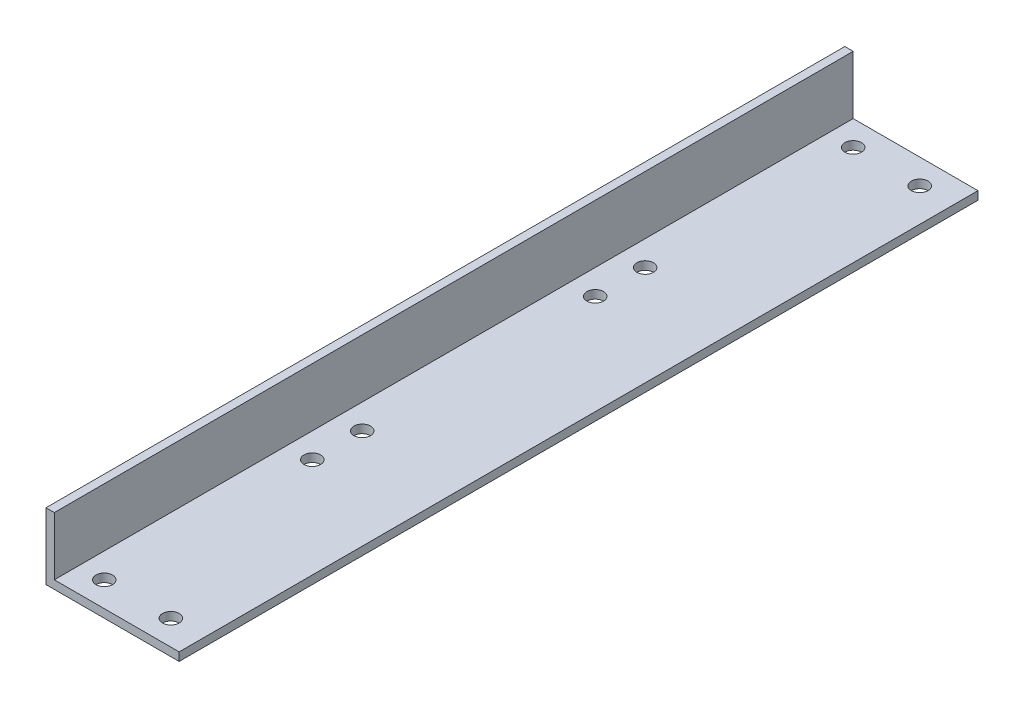
ISO-10303-21;
HEADER;
FILE_DESCRIPTION(('STEP AP214'),'2;1');
FILE_NAME('part.step','',(''),(''),'','','');
FILE_SCHEMA(('AUTOMOTIVE_DESIGN { 1 0 10303 214 1 1 1 1 }'));
ENDSEC;
DATA;
#1=APPLICATION_CONTEXT('core data for automotive mechanical design processes');
#2=APPLICATION_PROTOCOL_DEFINITION('international standard','automotive_design',2000,#1);
#3=PRODUCT_CONTEXT('',#1,'mechanical');
#4=PRODUCT('Part','Part','',(#3));
#5=PRODUCT_RELATED_PRODUCT_CATEGORY('part','',(#4));
#6=PRODUCT_DEFINITION_FORMATION('','',#4);
#7=PRODUCT_DEFINITION_CONTEXT('part definition',#1,'design');
#8=PRODUCT_DEFINITION('design','',#6,#7);
#9=PRODUCT_DEFINITION_SHAPE('','',#8);
#10=(LENGTH_UNIT() NAMED_UNIT(*) SI_UNIT(.MILLI.,.METRE.));
#11=(NAMED_UNIT(*) PLANE_ANGLE_UNIT() SI_UNIT($,.RADIAN.));
#12=(NAMED_UNIT(*) SI_UNIT($,.STERADIAN.) SOLID_ANGLE_UNIT());
#13=UNCERTAINTY_MEASURE_WITH_UNIT(LENGTH_MEASURE(1.E-05),#10,'distance_accuracy_value','');
#14=(GEOMETRIC_REPRESENTATION_CONTEXT(3) GLOBAL_UNCERTAINTY_ASSIGNED_CONTEXT((#13)) GLOBAL_UNIT_ASSIGNED_CONTEXT((#10,
#11,#12)) REPRESENTATION_CONTEXT('',''));
#15=CARTESIAN_POINT('',(0.,0.,0.));
#16=DIRECTION('',(0.,0.,1.));
#17=DIRECTION('',(1.,0.,0.));
#18=AXIS2_PLACEMENT_3D('',#15,#16,#17);
#19=CARTESIAN_POINT('',(3.175,3.17499999999999,304.8));
#20=DIRECTION('',(-1.,0.,0.));
#21=DIRECTION('',(0.,-1.,0.));
#22=AXIS2_PLACEMENT_3D('',#19,#20,#21);
#23=PLANE('',#22);
#24=DIRECTION('',(0.,0.,-1.));
#25=VECTOR('',#24,1.);
#26=CARTESIAN_POINT('',(3.175,25.4,304.8));
#27=LINE('',#26,#25);
#28=CARTESIAN_POINT('',(3.175,25.4,0.));
#29=VERTEX_POINT('',#28);
#30=CARTESIAN_POINT('',(3.175,25.4,304.8));
#31=VERTEX_POINT('',#30);
#32=EDGE_CURVE('E104',#29,#31,#27,.F.);
#33=ORIENTED_EDGE('',*,*,#32,.T.);
#34=DIRECTION('',(0.,1.,0.));
#35=VECTOR('',#34,1.);
#36=CARTESIAN_POINT('',(3.175,0.,304.8));
#37=LINE('',#36,#35);
#38=CARTESIAN_POINT('',(3.175,3.175,304.8));
#39=VERTEX_POINT('',#38);
#40=EDGE_CURVE('E91',#39,#31,#37,.T.);
#41=ORIENTED_EDGE('',*,*,#40,.F.);
#42=DIRECTION('',(0.,0.,1.));
#43=VECTOR('',#42,1.);
#44=CARTESIAN_POINT('',(3.175,3.17499999999999,304.8));
#45=LINE('',#44,#43);
#46=CARTESIAN_POINT('',(3.175,3.175,0.));
#47=VERTEX_POINT('',#46);
#48=EDGE_CURVE('E67',#39,#47,#45,.F.);
#49=ORIENTED_EDGE('',*,*,#48,.T.);
#50=DIRECTION('',(0.,1.,0.));
#51=VECTOR('',#50,1.);
#52=CARTESIAN_POINT('',(3.175,0.,0.));
#53=LINE('',#52,#51);
#54=EDGE_CURVE('E219',#47,#29,#53,.T.);
#55=ORIENTED_EDGE('',*,*,#54,.T.);
#56=EDGE_LOOP('',(#33,#41,#49,#55));
#57=FACE_BOUND('',#56,.T.);
#58=ADVANCED_FACE('F17',(#57),#23,.F.);
#59=CARTESIAN_POINT('',(3.175,25.4,304.8));
#60=DIRECTION('',(0.,-1.,0.));
#61=DIRECTION('',(0.,0.,-1.));
#62=AXIS2_PLACEMENT_3D('',#59,#60,#61);
#63=PLANE('',#62);
#64=DIRECTION('',(0.,0.,1.));
#65=VECTOR('',#64,1.);
#66=CARTESIAN_POINT('',(0.,25.4,304.8));
#67=LINE('',#66,#65);
#68=CARTESIAN_POINT('',(0.,25.4,0.));
#69=VERTEX_POINT('',#68);
#70=CARTESIAN_POINT('',(0.,25.4,304.8));
#71=VERTEX_POINT('',#70);
#72=EDGE_CURVE('E73',#69,#71,#67,.T.);
#73=ORIENTED_EDGE('',*,*,#72,.T.);
#74=DIRECTION('',(1.,0.,0.));
#75=VECTOR('',#74,1.);
#76=CARTESIAN_POINT('',(0.,25.4,304.8));
#77=LINE('',#76,#75);
#78=EDGE_CURVE('E76',#31,#71,#77,.F.);
#79=ORIENTED_EDGE('',*,*,#78,.F.);
#80=ORIENTED_EDGE('',*,*,#32,.F.);
#81=DIRECTION('',(1.,0.,0.));
#82=VECTOR('',#81,1.);
#83=CARTESIAN_POINT('',(0.,25.4,0.));
#84=LINE('',#83,#82);
#85=EDGE_CURVE('E78',#29,#69,#84,.F.);
#86=ORIENTED_EDGE('',*,*,#85,.T.);
#87=EDGE_LOOP('',(#73,#79,#80,#86));
#88=FACE_BOUND('',#87,.T.);
#89=ADVANCED_FACE('F75',(#88),#63,.F.);
#90=CARTESIAN_POINT('',(50.8,3.175,304.8));
#91=DIRECTION('',(0.,-1.,0.));
#92=DIRECTION('',(1.,0.,0.));
#93=AXIS2_PLACEMENT_3D('',#90,#91,#92);
#94=PLANE('',#93);
#95=CARTESIAN_POINT('',(38.1,3.175,295.275));
#96=DIRECTION('',(0.,-1.,0.));
#97=DIRECTION('',(0.,0.,-1.));
#98=AXIS2_PLACEMENT_3D('',#95,#96,#97);
#99=CIRCLE('',#98,3.17499999999998);
#100=CARTESIAN_POINT('',(38.1,3.175,292.1));
#101=VERTEX_POINT('',#100);
#102=EDGE_CURVE('E127',#101,#101,#99,.T.);
#103=ORIENTED_EDGE('',*,*,#102,.T.);
#104=EDGE_LOOP('',(#103));
#105=FACE_BOUND('',#104,.T.);
#106=CARTESIAN_POINT('',(12.7,3.175,295.275));
#107=DIRECTION('',(0.,-1.,0.));
#108=DIRECTION('',(0.,0.,-1.));
#109=AXIS2_PLACEMENT_3D('',#106,#107,#108);
#110=CIRCLE('',#109,3.17499999999998);
#111=CARTESIAN_POINT('',(12.7,3.175,292.1));
#112=VERTEX_POINT('',#111);
#113=EDGE_CURVE('E130',#112,#112,#110,.T.);
#114=ORIENTED_EDGE('',*,*,#113,.T.);
#115=EDGE_LOOP('',(#114));
#116=FACE_BOUND('',#115,.T.);
#117=CARTESIAN_POINT('',(12.7,3.175,196.85));
#118=DIRECTION('',(0.,-1.,0.));
#119=DIRECTION('',(0.,0.,-1.));
#120=AXIS2_PLACEMENT_3D('',#117,#118,#119);
#121=CIRCLE('',#120,3.17500000000001);
#122=CARTESIAN_POINT('',(12.7,3.175,193.675));
#123=VERTEX_POINT('',#122);
#124=EDGE_CURVE('E133',#123,#123,#121,.T.);
#125=ORIENTED_EDGE('',*,*,#124,.T.);
#126=EDGE_LOOP('',(#125));
#127=FACE_BOUND('',#126,.T.);
#128=CARTESIAN_POINT('',(12.7,3.175,215.9));
#129=DIRECTION('',(0.,-1.,0.));
#130=DIRECTION('',(0.,0.,-1.));
#131=AXIS2_PLACEMENT_3D('',#128,#129,#130);
#132=CIRCLE('',#131,3.17500000000001);
#133=CARTESIAN_POINT('',(12.7,3.175,212.725));
#134=VERTEX_POINT('',#133);
#135=EDGE_CURVE('E136',#134,#134,#132,.T.);
#136=ORIENTED_EDGE('',*,*,#135,.T.);
#137=EDGE_LOOP('',(#136));
#138=FACE_BOUND('',#137,.T.);
#139=ORIENTED_EDGE('',*,*,#48,.F.);
#140=DIRECTION('',(1.,0.,0.));
#141=VECTOR('',#140,1.);
#142=CARTESIAN_POINT('',(0.,3.175,304.8));
#143=LINE('',#142,#141);
#144=CARTESIAN_POINT('',(50.8,3.175,304.8));
#145=VERTEX_POINT('',#144);
#146=EDGE_CURVE('E98',#145,#39,#143,.F.);
#147=ORIENTED_EDGE('',*,*,#146,.F.);
#148=DIRECTION('',(0.,0.,1.));
#149=VECTOR('',#148,1.);
#150=CARTESIAN_POINT('',(50.8,3.175,304.8));
#151=LINE('',#150,#149);
#152=CARTESIAN_POINT('',(50.8,3.175,0.));
#153=VERTEX_POINT('',#152);
#154=EDGE_CURVE('E228',#145,#153,#151,.F.);
#155=ORIENTED_EDGE('',*,*,#154,.T.);
#156=DIRECTION('',(1.,0.,0.));
#157=VECTOR('',#156,1.);
#158=CARTESIAN_POINT('',(0.,3.175,0.));
#159=LINE('',#158,#157);
#160=EDGE_CURVE('E222',#153,#47,#159,.F.);
#161=ORIENTED_EDGE('',*,*,#160,.T.);
#162=EDGE_LOOP('',(#139,#147,#155,#161));
#163=FACE_BOUND('',#162,.T.);
#164=CARTESIAN_POINT('',(12.7,3.175,9.525));
#165=DIRECTION('',(0.,-1.,0.));
#166=DIRECTION('',(0.,0.,-1.));
#167=AXIS2_PLACEMENT_3D('',#164,#165,#166);
#168=CIRCLE('',#167,3.175);
#169=CARTESIAN_POINT('',(12.7,3.175,6.35));
#170=VERTEX_POINT('',#169);
#171=EDGE_CURVE('E84',#170,#170,#168,.T.);
#172=ORIENTED_EDGE('',*,*,#171,.T.);
#173=EDGE_LOOP('',(#172));
#174=FACE_BOUND('',#173,.T.);
#175=CARTESIAN_POINT('',(38.1,3.175,9.525));
#176=DIRECTION('',(0.,-1.,0.));
#177=DIRECTION('',(0.,0.,-1.));
#178=AXIS2_PLACEMENT_3D('',#175,#176,#177);
#179=CIRCLE('',#178,3.175);
#180=CARTESIAN_POINT('',(38.1,3.175,6.35000000000001));
#181=VERTEX_POINT('',#180);
#182=EDGE_CURVE('E142',#181,#181,#179,.T.);
#183=ORIENTED_EDGE('',*,*,#182,.T.);
#184=EDGE_LOOP('',(#183));
#185=FACE_BOUND('',#184,.T.);
#186=CARTESIAN_POINT('',(12.7,3.175,107.95));
#187=DIRECTION('',(0.,-1.,0.));
#188=DIRECTION('',(0.,0.,-1.));
#189=AXIS2_PLACEMENT_3D('',#186,#187,#188);
#190=CIRCLE('',#189,3.175);
#191=CARTESIAN_POINT('',(12.7,3.175,104.775));
#192=VERTEX_POINT('',#191);
#193=EDGE_CURVE('E144',#192,#192,#190,.T.);
#194=ORIENTED_EDGE('',*,*,#193,.T.);
#195=EDGE_LOOP('',(#194));
#196=FACE_BOUND('',#195,.T.);
#197=CARTESIAN_POINT('',(12.7,3.175,88.9));
#198=DIRECTION('',(0.,-1.,0.));
#199=DIRECTION('',(0.,0.,-1.));
#200=AXIS2_PLACEMENT_3D('',#197,#198,#199);
#201=CIRCLE('',#200,3.175);
#202=CARTESIAN_POINT('',(12.7,3.175,85.725));
#203=VERTEX_POINT('',#202);
#204=EDGE_CURVE('E20',#203,#203,#201,.T.);
#205=ORIENTED_EDGE('',*,*,#204,.T.);
#206=EDGE_LOOP('',(#205));
#207=FACE_BOUND('',#206,.T.);
#208=ADVANCED_FACE('F151',(#105,#116,#127,#138,#163,#174,#185,#196,#207),#94,.F.);
#209=CARTESIAN_POINT('',(12.7,25.4,88.9));
#210=DIRECTION('',(0.,-1.,0.));
#211=DIRECTION('',(0.,0.,-1.));
#212=AXIS2_PLACEMENT_3D('',#209,#210,#211);
#213=CYLINDRICAL_SURFACE('',#212,3.175);
#214=ORIENTED_EDGE('',*,*,#204,.F.);
#215=EDGE_LOOP('',(#214));
#216=FACE_BOUND('',#215,.T.);
#217=CARTESIAN_POINT('',(12.7,0.,88.9));
#218=DIRECTION('',(0.,-1.,0.));
#219=DIRECTION('',(0.,0.,-1.));
#220=AXIS2_PLACEMENT_3D('',#217,#218,#219);
#221=CIRCLE('',#220,3.175);
#222=CARTESIAN_POINT('',(12.7,0.,85.725));
#223=VERTEX_POINT('',#222);
#224=EDGE_CURVE('E124',#223,#223,#221,.T.);
#225=ORIENTED_EDGE('',*,*,#224,.T.);
#226=EDGE_LOOP('',(#225));
#227=FACE_BOUND('',#226,.T.);
#228=ADVANCED_FACE('F153',(#216,#227),#213,.F.);
#229=CARTESIAN_POINT('',(12.7,25.4,107.95));
#230=DIRECTION('',(0.,-1.,0.));
#231=DIRECTION('',(0.,0.,-1.));
#232=AXIS2_PLACEMENT_3D('',#229,#230,#231);
#233=CYLINDRICAL_SURFACE('',#232,3.175);
#234=ORIENTED_EDGE('',*,*,#193,.F.);
#235=EDGE_LOOP('',(#234));
#236=FACE_BOUND('',#235,.T.);
#237=CARTESIAN_POINT('',(12.7,0.,107.95));
#238=DIRECTION('',(0.,-1.,0.));
#239=DIRECTION('',(0.,0.,-1.));
#240=AXIS2_PLACEMENT_3D('',#237,#238,#239);
#241=CIRCLE('',#240,3.175);
#242=CARTESIAN_POINT('',(12.7,0.,104.775));
#243=VERTEX_POINT('',#242);
#244=EDGE_CURVE('E121',#243,#243,#241,.T.);
#245=ORIENTED_EDGE('',*,*,#244,.T.);
#246=EDGE_LOOP('',(#245));
#247=FACE_BOUND('',#246,.T.);
#248=ADVANCED_FACE('F156',(#236,#247),#233,.F.);
#249=CARTESIAN_POINT('',(38.1,25.4,9.525));
#250=DIRECTION('',(0.,-1.,0.));
#251=DIRECTION('',(0.,0.,-1.));
#252=AXIS2_PLACEMENT_3D('',#249,#250,#251);
#253=CYLINDRICAL_SURFACE('',#252,3.175);
#254=ORIENTED_EDGE('',*,*,#182,.F.);
#255=EDGE_LOOP('',(#254));
#256=FACE_BOUND('',#255,.T.);
#257=CARTESIAN_POINT('',(38.1,0.,9.525));
#258=DIRECTION('',(0.,-1.,0.));
#259=DIRECTION('',(0.,0.,-1.));
#260=AXIS2_PLACEMENT_3D('',#257,#258,#259);
#261=CIRCLE('',#260,3.175);
#262=CARTESIAN_POINT('',(38.1,0.,6.35000000000001));
#263=VERTEX_POINT('',#262);
#264=EDGE_CURVE('E118',#263,#263,#261,.T.);
#265=ORIENTED_EDGE('',*,*,#264,.T.);
#266=EDGE_LOOP('',(#265));
#267=FACE_BOUND('',#266,.T.);
#268=ADVANCED_FACE('F200',(#256,#267),#253,.F.);
#269=CARTESIAN_POINT('',(12.7,25.4,9.525));
#270=DIRECTION('',(0.,-1.,0.));
#271=DIRECTION('',(0.,0.,-1.));
#272=AXIS2_PLACEMENT_3D('',#269,#270,#271);
#273=CYLINDRICAL_SURFACE('',#272,3.175);
#274=ORIENTED_EDGE('',*,*,#171,.F.);
#275=EDGE_LOOP('',(#274));
#276=FACE_BOUND('',#275,.T.);
#277=CARTESIAN_POINT('',(12.7,0.,9.525));
#278=DIRECTION('',(0.,-1.,0.));
#279=DIRECTION('',(0.,0.,-1.));
#280=AXIS2_PLACEMENT_3D('',#277,#278,#279);
#281=CIRCLE('',#280,3.175);
#282=CARTESIAN_POINT('',(12.7,0.,6.35));
#283=VERTEX_POINT('',#282);
#284=EDGE_CURVE('E115',#283,#283,#281,.T.);
#285=ORIENTED_EDGE('',*,*,#284,.T.);
#286=EDGE_LOOP('',(#285));
#287=FACE_BOUND('',#286,.T.);
#288=ADVANCED_FACE('F197',(#276,#287),#273,.F.);
#289=CARTESIAN_POINT('',(0.,25.4,304.8));
#290=DIRECTION('',(1.,0.,0.));
#291=DIRECTION('',(0.,1.,0.));
#292=AXIS2_PLACEMENT_3D('',#289,#290,#291);
#293=PLANE('',#292);
#294=DIRECTION('',(0.,0.,1.));
#295=VECTOR('',#294,1.);
#296=CARTESIAN_POINT('',(0.,0.,304.8));
#297=LINE('',#296,#295);
#298=CARTESIAN_POINT('',(0.,0.,0.));
#299=VERTEX_POINT('',#298);
#300=CARTESIAN_POINT('',(0.,0.,304.8));
#301=VERTEX_POINT('',#300);
#302=EDGE_CURVE('E97',#299,#301,#297,.T.);
#303=ORIENTED_EDGE('',*,*,#302,.T.);
#304=DIRECTION('',(0.,1.,0.));
#305=VECTOR('',#304,1.);
#306=CARTESIAN_POINT('',(0.,0.,304.8));
#307=LINE('',#306,#305);
#308=EDGE_CURVE('E83',#71,#301,#307,.F.);
#309=ORIENTED_EDGE('',*,*,#308,.F.);
#310=ORIENTED_EDGE('',*,*,#72,.F.);
#311=DIRECTION('',(0.,1.,0.));
#312=VECTOR('',#311,1.);
#313=CARTESIAN_POINT('',(0.,0.,0.));
#314=LINE('',#313,#312);
#315=EDGE_CURVE('E139',#69,#299,#314,.F.);
#316=ORIENTED_EDGE('',*,*,#315,.T.);
#317=EDGE_LOOP('',(#303,#309,#310,#316));
#318=FACE_BOUND('',#317,.T.);
#319=ADVANCED_FACE('F96',(#318),#293,.F.);
#320=CARTESIAN_POINT('',(0.,0.,304.8));
#321=DIRECTION('',(0.,0.,1.));
#322=DIRECTION('',(1.,0.,0.));
#323=AXIS2_PLACEMENT_3D('',#320,#321,#322);
#324=PLANE('',#323);
#325=ORIENTED_EDGE('',*,*,#40,.T.);
#326=ORIENTED_EDGE('',*,*,#78,.T.);
#327=ORIENTED_EDGE('',*,*,#308,.T.);
#328=DIRECTION('',(1.,0.,0.));
#329=VECTOR('',#328,1.);
#330=CARTESIAN_POINT('',(0.,0.,304.8));
#331=LINE('',#330,#329);
#332=CARTESIAN_POINT('',(50.8,0.,304.8));
#333=VERTEX_POINT('',#332);
#334=EDGE_CURVE('E231',#301,#333,#331,.T.);
#335=ORIENTED_EDGE('',*,*,#334,.T.);
#336=DIRECTION('',(0.,1.,0.));
#337=VECTOR('',#336,1.);
#338=CARTESIAN_POINT('',(50.8,0.,304.8));
#339=LINE('',#338,#337);
#340=EDGE_CURVE('E93',#333,#145,#339,.T.);
#341=ORIENTED_EDGE('',*,*,#340,.T.);
#342=ORIENTED_EDGE('',*,*,#146,.T.);
#343=EDGE_LOOP('',(#325,#326,#327,#335,#341,#342));
#344=FACE_BOUND('',#343,.T.);
#345=ADVANCED_FACE('F87',(#344),#324,.T.);
#346=CARTESIAN_POINT('',(50.8,0.,304.8));
#347=DIRECTION('',(-1.,0.,0.));
#348=DIRECTION('',(0.,0.,1.));
#349=AXIS2_PLACEMENT_3D('',#346,#347,#348);
#350=PLANE('',#349);
#351=ORIENTED_EDGE('',*,*,#154,.F.);
#352=ORIENTED_EDGE('',*,*,#340,.F.);
#353=DIRECTION('',(0.,0.,1.));
#354=VECTOR('',#353,1.);
#355=CARTESIAN_POINT('',(50.8,0.,304.8));
#356=LINE('',#355,#354);
#357=CARTESIAN_POINT('',(50.8,0.,0.));
#358=VERTEX_POINT('',#357);
#359=EDGE_CURVE('E235',#333,#358,#356,.F.);
#360=ORIENTED_EDGE('',*,*,#359,.T.);
#361=DIRECTION('',(0.,1.,0.));
#362=VECTOR('',#361,1.);
#363=CARTESIAN_POINT('',(50.8,0.,0.));
#364=LINE('',#363,#362);
#365=EDGE_CURVE('E35',#358,#153,#364,.T.);
#366=ORIENTED_EDGE('',*,*,#365,.T.);
#367=EDGE_LOOP('',(#351,#352,#360,#366));
#368=FACE_BOUND('',#367,.T.);
#369=ADVANCED_FACE('F189',(#368),#350,.F.);
#370=CARTESIAN_POINT('',(0.,0.,0.));
#371=DIRECTION('',(0.,0.,1.));
#372=DIRECTION('',(1.,0.,0.));
#373=AXIS2_PLACEMENT_3D('',#370,#371,#372);
#374=PLANE('',#373);
#375=ORIENTED_EDGE('',*,*,#85,.F.);
#376=ORIENTED_EDGE('',*,*,#54,.F.);
#377=ORIENTED_EDGE('',*,*,#160,.F.);
#378=ORIENTED_EDGE('',*,*,#365,.F.);
#379=DIRECTION('',(1.,0.,0.));
#380=VECTOR('',#379,1.);
#381=CARTESIAN_POINT('',(0.,0.,0.));
#382=LINE('',#381,#380);
#383=EDGE_CURVE('E114',#358,#299,#382,.F.);
#384=ORIENTED_EDGE('',*,*,#383,.T.);
#385=ORIENTED_EDGE('',*,*,#315,.F.);
#386=EDGE_LOOP('',(#375,#376,#377,#378,#384,#385));
#387=FACE_BOUND('',#386,.T.);
#388=ADVANCED_FACE('F185',(#387),#374,.F.);
#389=CARTESIAN_POINT('',(12.7,25.4,215.9));
#390=DIRECTION('',(0.,-1.,0.));
#391=DIRECTION('',(0.,0.,-1.));
#392=AXIS2_PLACEMENT_3D('',#389,#390,#391);
#393=CYLINDRICAL_SURFACE('',#392,3.17500000000001);
#394=CARTESIAN_POINT('',(12.7,0.,215.9));
#395=DIRECTION('',(0.,-1.,0.));
#396=DIRECTION('',(0.,0.,-1.));
#397=AXIS2_PLACEMENT_3D('',#394,#395,#396);
#398=CIRCLE('',#397,3.17500000000001);
#399=CARTESIAN_POINT('',(12.7,0.,212.725));
#400=VERTEX_POINT('',#399);
#401=EDGE_CURVE('E111',#400,#400,#398,.T.);
#402=ORIENTED_EDGE('',*,*,#401,.T.);
#403=EDGE_LOOP('',(#402));
#404=FACE_BOUND('',#403,.T.);
#405=ORIENTED_EDGE('',*,*,#135,.F.);
#406=EDGE_LOOP('',(#405));
#407=FACE_BOUND('',#406,.T.);
#408=ADVANCED_FACE('F181',(#404,#407),#393,.F.);
#409=CARTESIAN_POINT('',(12.7,25.4,196.85));
#410=DIRECTION('',(0.,-1.,0.));
#411=DIRECTION('',(0.,0.,-1.));
#412=AXIS2_PLACEMENT_3D('',#409,#410,#411);
#413=CYLINDRICAL_SURFACE('',#412,3.17500000000001);
#414=CARTESIAN_POINT('',(12.7,0.,196.85));
#415=DIRECTION('',(0.,-1.,0.));
#416=DIRECTION('',(0.,0.,-1.));
#417=AXIS2_PLACEMENT_3D('',#414,#415,#416);
#418=CIRCLE('',#417,3.17500000000001);
#419=CARTESIAN_POINT('',(12.7,0.,193.675));
#420=VERTEX_POINT('',#419);
#421=EDGE_CURVE('E108',#420,#420,#418,.T.);
#422=ORIENTED_EDGE('',*,*,#421,.T.);
#423=EDGE_LOOP('',(#422));
#424=FACE_BOUND('',#423,.T.);
#425=ORIENTED_EDGE('',*,*,#124,.F.);
#426=EDGE_LOOP('',(#425));
#427=FACE_BOUND('',#426,.T.);
#428=ADVANCED_FACE('F177',(#424,#427),#413,.F.);
#429=CARTESIAN_POINT('',(12.7,25.4,295.275));
#430=DIRECTION('',(0.,-1.,0.));
#431=DIRECTION('',(0.,0.,-1.));
#432=AXIS2_PLACEMENT_3D('',#429,#430,#431);
#433=CYLINDRICAL_SURFACE('',#432,3.17499999999998);
#434=CARTESIAN_POINT('',(12.7,0.,295.275));
#435=DIRECTION('',(0.,-1.,0.));
#436=DIRECTION('',(0.,0.,-1.));
#437=AXIS2_PLACEMENT_3D('',#434,#435,#436);
#438=CIRCLE('',#437,3.17499999999998);
#439=CARTESIAN_POINT('',(12.7,0.,292.1));
#440=VERTEX_POINT('',#439);
#441=EDGE_CURVE('E26',#440,#440,#438,.T.);
#442=ORIENTED_EDGE('',*,*,#441,.T.);
#443=EDGE_LOOP('',(#442));
#444=FACE_BOUND('',#443,.T.);
#445=ORIENTED_EDGE('',*,*,#113,.F.);
#446=EDGE_LOOP('',(#445));
#447=FACE_BOUND('',#446,.T.);
#448=ADVANCED_FACE('F169',(#444,#447),#433,.F.);
#449=CARTESIAN_POINT('',(38.1,25.4,295.275));
#450=DIRECTION('',(0.,-1.,0.));
#451=DIRECTION('',(0.,0.,-1.));
#452=AXIS2_PLACEMENT_3D('',#449,#450,#451);
#453=CYLINDRICAL_SURFACE('',#452,3.17499999999998);
#454=CARTESIAN_POINT('',(38.1,0.,295.275));
#455=DIRECTION('',(0.,-1.,0.));
#456=DIRECTION('',(0.,0.,-1.));
#457=AXIS2_PLACEMENT_3D('',#454,#455,#456);
#458=CIRCLE('',#457,3.17499999999998);
#459=CARTESIAN_POINT('',(38.1,0.,292.1));
#460=VERTEX_POINT('',#459);
#461=EDGE_CURVE('E11',#460,#460,#458,.T.);
#462=ORIENTED_EDGE('',*,*,#461,.T.);
#463=EDGE_LOOP('',(#462));
#464=FACE_BOUND('',#463,.T.);
#465=ORIENTED_EDGE('',*,*,#102,.F.);
#466=EDGE_LOOP('',(#465));
#467=FACE_BOUND('',#466,.T.);
#468=ADVANCED_FACE('F162',(#464,#467),#453,.F.);
#469=CARTESIAN_POINT('',(0.,0.,304.8));
#470=DIRECTION('',(0.,1.,0.));
#471=DIRECTION('',(0.,0.,1.));
#472=AXIS2_PLACEMENT_3D('',#469,#470,#471);
#473=PLANE('',#472);
#474=ORIENTED_EDGE('',*,*,#461,.F.);
#475=EDGE_LOOP('',(#474));
#476=FACE_BOUND('',#475,.T.);
#477=ORIENTED_EDGE('',*,*,#441,.F.);
#478=EDGE_LOOP('',(#477));
#479=FACE_BOUND('',#478,.T.);
#480=ORIENTED_EDGE('',*,*,#421,.F.);
#481=EDGE_LOOP('',(#480));
#482=FACE_BOUND('',#481,.T.);
#483=ORIENTED_EDGE('',*,*,#401,.F.);
#484=EDGE_LOOP('',(#483));
#485=FACE_BOUND('',#484,.T.);
#486=ORIENTED_EDGE('',*,*,#359,.F.);
#487=ORIENTED_EDGE('',*,*,#334,.F.);
#488=ORIENTED_EDGE('',*,*,#302,.F.);
#489=ORIENTED_EDGE('',*,*,#383,.F.);
#490=EDGE_LOOP('',(#486,#487,#488,#489));
#491=FACE_BOUND('',#490,.T.);
#492=ORIENTED_EDGE('',*,*,#284,.F.);
#493=EDGE_LOOP('',(#492));
#494=FACE_BOUND('',#493,.T.);
#495=ORIENTED_EDGE('',*,*,#264,.F.);
#496=EDGE_LOOP('',(#495));
#497=FACE_BOUND('',#496,.T.);
#498=ORIENTED_EDGE('',*,*,#244,.F.);
#499=EDGE_LOOP('',(#498));
#500=FACE_BOUND('',#499,.T.);
#501=ORIENTED_EDGE('',*,*,#224,.F.);
#502=EDGE_LOOP('',(#501));
#503=FACE_BOUND('',#502,.T.);
#504=ADVANCED_FACE('F160',(#476,#479,#482,#485,#491,#494,#497,#500,#503),#473,.F.);
#505=CLOSED_SHELL('',(#58,#89,#208,#228,#248,#268,#288,#319,#345,#369,#388,#408,#428,#448,#468,#504));
#506=MANIFOLD_SOLID_BREP('B1',#505);
#507=ADVANCED_BREP_SHAPE_REPRESENTATION('',(#18,#506),#14);
#508=SHAPE_DEFINITION_REPRESENTATION(#9,#507);
ENDSEC;
END-ISO-10303-21;
